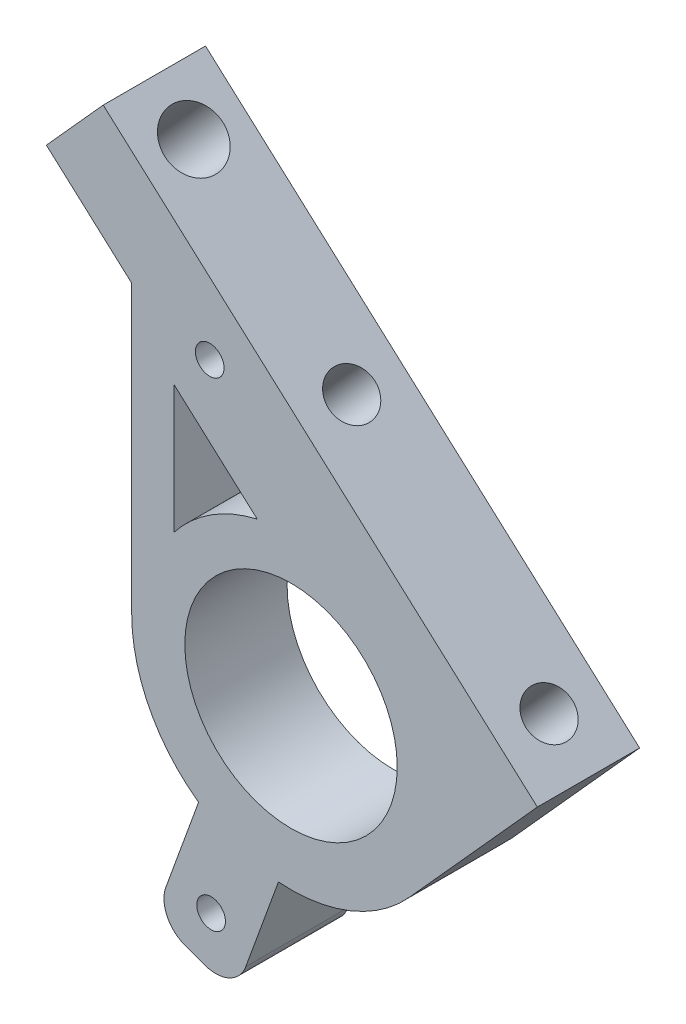
ISO-10303-21;
HEADER;
FILE_DESCRIPTION(('STEP AP214'),'2;1');
FILE_NAME('part.step','',(''),(''),'','','');
FILE_SCHEMA(('AUTOMOTIVE_DESIGN { 1 0 10303 214 1 1 1 1 }'));
ENDSEC;
DATA;
#1=APPLICATION_CONTEXT('core data for automotive mechanical design processes');
#2=APPLICATION_PROTOCOL_DEFINITION('international standard','automotive_design',2000,#1);
#3=PRODUCT_CONTEXT('',#1,'mechanical');
#4=PRODUCT('Part','Part','',(#3));
#5=PRODUCT_RELATED_PRODUCT_CATEGORY('part','',(#4));
#6=PRODUCT_DEFINITION_FORMATION('','',#4);
#7=PRODUCT_DEFINITION_CONTEXT('part definition',#1,'design');
#8=PRODUCT_DEFINITION('design','',#6,#7);
#9=PRODUCT_DEFINITION_SHAPE('','',#8);
#10=(LENGTH_UNIT() NAMED_UNIT(*) SI_UNIT(.MILLI.,.METRE.));
#11=(NAMED_UNIT(*) PLANE_ANGLE_UNIT() SI_UNIT($,.RADIAN.));
#12=(NAMED_UNIT(*) SI_UNIT($,.STERADIAN.) SOLID_ANGLE_UNIT());
#13=UNCERTAINTY_MEASURE_WITH_UNIT(LENGTH_MEASURE(1.E-05),#10,'distance_accuracy_value','');
#14=(GEOMETRIC_REPRESENTATION_CONTEXT(3) GLOBAL_UNCERTAINTY_ASSIGNED_CONTEXT((#13)) GLOBAL_UNIT_ASSIGNED_CONTEXT((#10,
#11,#12)) REPRESENTATION_CONTEXT('',''));
#15=CARTESIAN_POINT('',(0.,0.,0.));
#16=DIRECTION('',(0.,0.,1.));
#17=DIRECTION('',(1.,0.,0.));
#18=AXIS2_PLACEMENT_3D('',#15,#16,#17);
#19=CARTESIAN_POINT('',(0.,0.,9.63));
#20=DIRECTION('',(0.,0.,-1.));
#21=DIRECTION('',(-1.,0.,0.));
#22=AXIS2_PLACEMENT_3D('',#19,#20,#21);
#23=CYLINDRICAL_SURFACE('',#22,15.);
#24=DIRECTION('',(0.,0.,-1.));
#25=VECTOR('',#24,1.);
#26=CARTESIAN_POINT('',(-8.70329833664658,-12.2168980540612,27.8348131289452));
#27=LINE('',#26,#25);
#28=CARTESIAN_POINT('',(-8.70329833664658,-12.2168980540612,9.63));
#29=VERTEX_POINT('',#28);
#30=CARTESIAN_POINT('',(-8.70329833664658,-12.2168980540612,0.));
#31=VERTEX_POINT('',#30);
#32=EDGE_CURVE('E193',#29,#31,#27,.T.);
#33=ORIENTED_EDGE('',*,*,#32,.F.);
#34=CARTESIAN_POINT('',(0.,0.,9.63));
#35=DIRECTION('',(0.,0.,1.));
#36=DIRECTION('',(1.,0.,0.));
#37=AXIS2_PLACEMENT_3D('',#34,#35,#36);
#38=CIRCLE('',#37,15.);
#39=CARTESIAN_POINT('',(-15.,0.,9.63));
#40=VERTEX_POINT('',#39);
#41=EDGE_CURVE('E221',#40,#29,#38,.T.);
#42=ORIENTED_EDGE('',*,*,#41,.F.);
#43=DIRECTION('',(0.,0.,-1.));
#44=VECTOR('',#43,1.);
#45=CARTESIAN_POINT('',(-15.,0.,9.63));
#46=LINE('',#45,#44);
#47=CARTESIAN_POINT('',(-15.,0.,0.));
#48=VERTEX_POINT('',#47);
#49=EDGE_CURVE('E235',#40,#48,#46,.T.);
#50=ORIENTED_EDGE('',*,*,#49,.T.);
#51=CARTESIAN_POINT('',(0.,0.,0.));
#52=DIRECTION('',(0.,0.,1.));
#53=DIRECTION('',(1.,0.,0.));
#54=AXIS2_PLACEMENT_3D('',#51,#52,#53);
#55=CIRCLE('',#54,15.);
#56=EDGE_CURVE('E236',#48,#31,#55,.T.);
#57=ORIENTED_EDGE('',*,*,#56,.T.);
#58=EDGE_LOOP('',(#33,#42,#50,#57));
#59=FACE_BOUND('',#58,.T.);
#60=ADVANCED_FACE('F33',(#59),#23,.T.);
#61=DIRECTION('',(0.,0.,-1.));
#62=VECTOR('',#61,1.);
#63=CARTESIAN_POINT('',(-1.1857573703593,-14.9530592006665,27.8348131289452));
#64=LINE('',#63,#62);
#65=CARTESIAN_POINT('',(-1.1857573703593,-14.9530592006665,9.63));
#66=VERTEX_POINT('',#65);
#67=CARTESIAN_POINT('',(-1.1857573703593,-14.9530592006665,0.));
#68=VERTEX_POINT('',#67);
#69=EDGE_CURVE('E196',#66,#68,#64,.T.);
#70=ORIENTED_EDGE('',*,*,#69,.T.);
#71=CARTESIAN_POINT('',(11.1471723821609,-10.0369590953829,0.));
#72=VERTEX_POINT('',#71);
#73=EDGE_CURVE('E218',#68,#72,#55,.T.);
#74=ORIENTED_EDGE('',*,*,#73,.T.);
#75=DIRECTION('',(0.,0.,-1.));
#76=VECTOR('',#75,1.);
#77=CARTESIAN_POINT('',(11.1471723821609,-10.0369590953829,9.63));
#78=LINE('',#77,#76);
#79=CARTESIAN_POINT('',(11.1471723821609,-10.0369590953829,9.63));
#80=VERTEX_POINT('',#79);
#81=EDGE_CURVE('E263',#80,#72,#78,.T.);
#82=ORIENTED_EDGE('',*,*,#81,.F.);
#83=EDGE_CURVE('E225',#66,#80,#38,.T.);
#84=ORIENTED_EDGE('',*,*,#83,.F.);
#85=EDGE_LOOP('',(#70,#74,#82,#84));
#86=FACE_BOUND('',#85,.T.);
#87=ADVANCED_FACE('F338',(#86),#23,.T.);
#88=CARTESIAN_POINT('',(0.,0.,9.63));
#89=DIRECTION('',(0.,0.,1.));
#90=DIRECTION('',(1.,0.,0.));
#91=AXIS2_PLACEMENT_3D('',#88,#89,#90);
#92=PLANE('',#91);
#93=CARTESIAN_POINT('',(-7.6543469682057,24.3852304515143,9.63));
#94=DIRECTION('',(0.,0.,1.));
#95=DIRECTION('',(1.,0.,0.));
#96=AXIS2_PLACEMENT_3D('',#93,#94,#95);
#97=CIRCLE('',#96,1.35);
#98=CARTESIAN_POINT('',(-6.3043469682057,24.3852304515143,9.63));
#99=VERTEX_POINT('',#98);
#100=EDGE_CURVE('E436',#99,#99,#97,.T.);
#101=ORIENTED_EDGE('',*,*,#100,.F.);
#102=EDGE_LOOP('',(#101));
#103=FACE_BOUND('',#102,.T.);
#104=DIRECTION('',(-0.743144825477393,0.66913060635886,0.));
#105=VECTOR('',#104,1.);
#106=CARTESIAN_POINT('',(-11.,20.6695063241273,9.63));
#107=LINE('',#106,#105);
#108=CARTESIAN_POINT('',(-3.18503915994004,13.632883977708,9.63));
#109=VERTEX_POINT('',#108);
#110=CARTESIAN_POINT('',(-11.,20.6695063241273,9.63));
#111=VERTEX_POINT('',#110);
#112=EDGE_CURVE('E48',#109,#111,#107,.T.);
#113=ORIENTED_EDGE('',*,*,#112,.F.);
#114=CARTESIAN_POINT('',(0.,0.,9.63));
#115=DIRECTION('',(0.,0.,-1.));
#116=DIRECTION('',(-1.,0.,0.));
#117=AXIS2_PLACEMENT_3D('',#114,#115,#116);
#118=CIRCLE('',#117,14.);
#119=CARTESIAN_POINT('',(-11.,8.66025403784439,9.63));
#120=VERTEX_POINT('',#119);
#121=EDGE_CURVE('E154',#120,#109,#118,.T.);
#122=ORIENTED_EDGE('',*,*,#121,.F.);
#123=DIRECTION('',(0.,-1.,0.));
#124=VECTOR('',#123,1.);
#125=CARTESIAN_POINT('',(-11.,20.6695063241273,9.63));
#126=LINE('',#125,#124);
#127=EDGE_CURVE('E157',#111,#120,#126,.T.);
#128=ORIENTED_EDGE('',*,*,#127,.F.);
#129=EDGE_LOOP('',(#113,#122,#128));
#130=FACE_BOUND('',#129,.T.);
#131=CARTESIAN_POINT('',(-7.52444315316466,-20.67323765729,9.63));
#132=DIRECTION('',(0.,0.,1.));
#133=DIRECTION('',(1.,0.,0.));
#134=AXIS2_PLACEMENT_3D('',#131,#132,#133);
#135=CIRCLE('',#134,1.35);
#136=CARTESIAN_POINT('',(-6.17444315316466,-20.67323765729,9.63));
#137=VERTEX_POINT('',#136);
#138=EDGE_CURVE('E187',#137,#137,#135,.T.);
#139=ORIENTED_EDGE('',*,*,#138,.F.);
#140=EDGE_LOOP('',(#139));
#141=FACE_BOUND('',#140,.T.);
#142=DIRECTION('',(0.939692620785909,-0.342020143325666,0.));
#143=VECTOR('',#142,1.);
#144=CARTESIAN_POINT('',(-12.8075400565546,-23.4932095034921,9.63));
#145=LINE('',#144,#143);
#146=CARTESIAN_POINT('',(-9.98846219419685,-24.5192699334691,9.63));
#147=VERTEX_POINT('',#146);
#148=CARTESIAN_POINT('',(-8.10907695262503,-25.2033102201205,9.63));
#149=VERTEX_POINT('',#148);
#150=EDGE_CURVE('E206',#147,#149,#145,.T.);
#151=ORIENTED_EDGE('',*,*,#150,.T.);
#152=CARTESIAN_POINT('',(-7.08301652264803,-22.3842323577627,9.63));
#153=DIRECTION('',(0.,0.,1.));
#154=DIRECTION('',(1.,0.,0.));
#155=AXIS2_PLACEMENT_3D('',#152,#153,#154);
#156=CIRCLE('',#155,3.);
#157=CARTESIAN_POINT('',(-4.2639386602903,-23.4102927877397,9.63));
#158=VERTEX_POINT('',#157);
#159=EDGE_CURVE('E41',#149,#158,#156,.T.);
#160=ORIENTED_EDGE('',*,*,#159,.T.);
#161=DIRECTION('',(0.342020143325667,0.939692620785909,0.));
#162=VECTOR('',#161,1.);
#163=CARTESIAN_POINT('',(-1.1857573703593,-14.9530592006665,9.63));
#164=LINE('',#163,#162);
#165=EDGE_CURVE('E203',#158,#66,#164,.T.);
#166=ORIENTED_EDGE('',*,*,#165,.T.);
#167=ORIENTED_EDGE('',*,*,#83,.T.);
#168=DIRECTION('',(0.66913060635886,0.743144825477393,0.));
#169=VECTOR('',#168,1.);
#170=CARTESIAN_POINT('',(17.8384784457495,-2.60551084060896,9.63));
#171=LINE('',#170,#169);
#172=CARTESIAN_POINT('',(23.1915232966204,3.33964776321019,9.63));
#173=VERTEX_POINT('',#172);
#174=EDGE_CURVE('E224',#80,#173,#171,.T.);
#175=ORIENTED_EDGE('',*,*,#174,.T.);
#176=DIRECTION('',(-0.743144825477393,0.669130606358859,0.));
#177=VECTOR('',#176,1.);
#178=CARTESIAN_POINT('',(-17.6814421046363,40.1418311129475,9.63));
#179=LINE('',#178,#177);
#180=CARTESIAN_POINT('',(-17.6814421046363,40.1418311129475,9.63));
#181=VERTEX_POINT('',#180);
#182=EDGE_CURVE('E227',#173,#181,#179,.T.);
#183=ORIENTED_EDGE('',*,*,#182,.T.);
#184=DIRECTION('',(-0.669130606358859,-0.743144825477393,0.));
#185=VECTOR('',#184,1.);
#186=CARTESIAN_POINT('',(-23.0344869555071,34.1966725091283,9.63));
#187=LINE('',#186,#185);
#188=CARTESIAN_POINT('',(-23.0344869555071,34.1966725091283,9.63));
#189=VERTEX_POINT('',#188);
#190=EDGE_CURVE('E229',#181,#189,#187,.T.);
#191=ORIENTED_EDGE('',*,*,#190,.T.);
#192=DIRECTION('',(0.743144825477394,-0.669130606358859,0.));
#193=VECTOR('',#192,1.);
#194=CARTESIAN_POINT('',(-15.,26.9623879605314,9.63));
#195=LINE('',#194,#193);
#196=CARTESIAN_POINT('',(-15.,26.9623879605314,9.63));
#197=VERTEX_POINT('',#196);
#198=EDGE_CURVE('E231',#189,#197,#195,.T.);
#199=ORIENTED_EDGE('',*,*,#198,.T.);
#200=DIRECTION('',(0.,-1.,0.));
#201=VECTOR('',#200,1.);
#202=CARTESIAN_POINT('',(-15.,0.,9.63));
#203=LINE('',#202,#201);
#204=EDGE_CURVE('E233',#197,#40,#203,.T.);
#205=ORIENTED_EDGE('',*,*,#204,.T.);
#206=ORIENTED_EDGE('',*,*,#41,.T.);
#207=DIRECTION('',(-0.342020143325666,-0.939692620785909,0.));
#208=VECTOR('',#207,1.);
#209=CARTESIAN_POINT('',(-8.70329833664658,-12.2168980540612,9.63));
#210=LINE('',#209,#208);
#211=CARTESIAN_POINT('',(-11.7814796265776,-20.6741316411344,9.63));
#212=VERTEX_POINT('',#211);
#213=EDGE_CURVE('E209',#29,#212,#210,.T.);
#214=ORIENTED_EDGE('',*,*,#213,.T.);
#215=CARTESIAN_POINT('',(-8.96240176421985,-21.7001920711114,9.63));
#216=DIRECTION('',(0.,0.,1.));
#217=DIRECTION('',(1.,0.,0.));
#218=AXIS2_PLACEMENT_3D('',#215,#216,#217);
#219=CIRCLE('',#218,3.);
#220=EDGE_CURVE('E278',#212,#147,#219,.T.);
#221=ORIENTED_EDGE('',*,*,#220,.T.);
#222=EDGE_LOOP('',(#151,#160,#166,#167,#175,#183,#191,#199,#205,#206,#214,#221));
#223=FACE_BOUND('',#222,.T.);
#224=CARTESIAN_POINT('',(0.,0.,9.63));
#225=DIRECTION('',(0.,0.,1.));
#226=DIRECTION('',(1.,0.,0.));
#227=AXIS2_PLACEMENT_3D('',#224,#225,#226);
#228=CIRCLE('',#227,10.);
#229=CARTESIAN_POINT('',(10.,0.,9.63));
#230=VERTEX_POINT('',#229);
#231=EDGE_CURVE('E215',#230,#230,#228,.T.);
#232=ORIENTED_EDGE('',*,*,#231,.F.);
#233=EDGE_LOOP('',(#232));
#234=FACE_BOUND('',#233,.T.);
#235=ADVANCED_FACE('F282',(#103,#130,#141,#223,#234),#92,.T.);
#236=CARTESIAN_POINT('',(0.,0.,0.));
#237=DIRECTION('',(0.,0.,1.));
#238=DIRECTION('',(1.,0.,0.));
#239=AXIS2_PLACEMENT_3D('',#236,#237,#238);
#240=PLANE('',#239);
#241=CARTESIAN_POINT('',(-7.6543469682057,24.3852304515143,0.));
#242=DIRECTION('',(0.,0.,1.));
#243=DIRECTION('',(1.,0.,0.));
#244=AXIS2_PLACEMENT_3D('',#241,#242,#243);
#245=CIRCLE('',#244,1.35);
#246=CARTESIAN_POINT('',(-6.3043469682057,24.3852304515143,0.));
#247=VERTEX_POINT('',#246);
#248=EDGE_CURVE('E160',#247,#247,#245,.F.);
#249=ORIENTED_EDGE('',*,*,#248,.F.);
#250=EDGE_LOOP('',(#249));
#251=FACE_BOUND('',#250,.T.);
#252=CARTESIAN_POINT('',(0.,0.,0.));
#253=DIRECTION('',(0.,0.,-1.));
#254=DIRECTION('',(-1.,0.,0.));
#255=AXIS2_PLACEMENT_3D('',#252,#253,#254);
#256=CIRCLE('',#255,14.);
#257=CARTESIAN_POINT('',(-11.,8.66025403784439,0.));
#258=VERTEX_POINT('',#257);
#259=CARTESIAN_POINT('',(-3.18503915994004,13.632883977708,0.));
#260=VERTEX_POINT('',#259);
#261=EDGE_CURVE('E56',#258,#260,#256,.T.);
#262=ORIENTED_EDGE('',*,*,#261,.T.);
#263=DIRECTION('',(-0.743144825477393,0.66913060635886,0.));
#264=VECTOR('',#263,1.);
#265=CARTESIAN_POINT('',(-11.,20.6695063241273,0.));
#266=LINE('',#265,#264);
#267=CARTESIAN_POINT('',(-11.,20.6695063241273,0.));
#268=VERTEX_POINT('',#267);
#269=EDGE_CURVE('E141',#260,#268,#266,.T.);
#270=ORIENTED_EDGE('',*,*,#269,.T.);
#271=DIRECTION('',(0.,-1.,0.));
#272=VECTOR('',#271,1.);
#273=CARTESIAN_POINT('',(-11.,20.6695063241273,0.));
#274=LINE('',#273,#272);
#275=EDGE_CURVE('E148',#268,#258,#274,.T.);
#276=ORIENTED_EDGE('',*,*,#275,.T.);
#277=EDGE_LOOP('',(#262,#270,#276));
#278=FACE_BOUND('',#277,.T.);
#279=CARTESIAN_POINT('',(-7.52444315316466,-20.67323765729,0.));
#280=DIRECTION('',(0.,0.,1.));
#281=DIRECTION('',(1.,0.,0.));
#282=AXIS2_PLACEMENT_3D('',#279,#280,#281);
#283=CIRCLE('',#282,1.35);
#284=CARTESIAN_POINT('',(-6.17444315316466,-20.67323765729,0.));
#285=VERTEX_POINT('',#284);
#286=EDGE_CURVE('E190',#285,#285,#283,.F.);
#287=ORIENTED_EDGE('',*,*,#286,.F.);
#288=EDGE_LOOP('',(#287));
#289=FACE_BOUND('',#288,.T.);
#290=DIRECTION('',(0.342020143325666,0.939692620785909,0.));
#291=VECTOR('',#290,1.);
#292=CARTESIAN_POINT('',(-1.1857573703593,-14.9530592006665,0.));
#293=LINE('',#292,#291);
#294=CARTESIAN_POINT('',(-4.2639386602903,-23.4102927877397,0.));
#295=VERTEX_POINT('',#294);
#296=EDGE_CURVE('E194',#295,#68,#293,.T.);
#297=ORIENTED_EDGE('',*,*,#296,.F.);
#298=CARTESIAN_POINT('',(-7.08301652264803,-22.3842323577627,0.));
#299=DIRECTION('',(0.,0.,1.));
#300=DIRECTION('',(1.,0.,0.));
#301=AXIS2_PLACEMENT_3D('',#298,#299,#300);
#302=CIRCLE('',#301,3.);
#303=CARTESIAN_POINT('',(-8.10907695262503,-25.2033102201205,0.));
#304=VERTEX_POINT('',#303);
#305=EDGE_CURVE('E271',#295,#304,#302,.F.);
#306=ORIENTED_EDGE('',*,*,#305,.T.);
#307=DIRECTION('',(0.939692620785909,-0.342020143325666,0.));
#308=VECTOR('',#307,1.);
#309=CARTESIAN_POINT('',(-12.8075400565546,-23.4932095034921,0.));
#310=LINE('',#309,#308);
#311=CARTESIAN_POINT('',(-9.98846219419685,-24.5192699334691,0.));
#312=VERTEX_POINT('',#311);
#313=EDGE_CURVE('E197',#312,#304,#310,.T.);
#314=ORIENTED_EDGE('',*,*,#313,.F.);
#315=CARTESIAN_POINT('',(-8.96240176421985,-21.7001920711114,0.));
#316=DIRECTION('',(0.,0.,1.));
#317=DIRECTION('',(1.,0.,0.));
#318=AXIS2_PLACEMENT_3D('',#315,#316,#317);
#319=CIRCLE('',#318,3.);
#320=CARTESIAN_POINT('',(-11.7814796265776,-20.6741316411344,0.));
#321=VERTEX_POINT('',#320);
#322=EDGE_CURVE('E269',#312,#321,#319,.F.);
#323=ORIENTED_EDGE('',*,*,#322,.T.);
#324=DIRECTION('',(-0.342020143325666,-0.939692620785909,0.));
#325=VECTOR('',#324,1.);
#326=CARTESIAN_POINT('',(-8.70329833664658,-12.2168980540612,0.));
#327=LINE('',#326,#325);
#328=EDGE_CURVE('E200',#31,#321,#327,.T.);
#329=ORIENTED_EDGE('',*,*,#328,.F.);
#330=ORIENTED_EDGE('',*,*,#56,.F.);
#331=DIRECTION('',(0.,-1.,0.));
#332=VECTOR('',#331,1.);
#333=CARTESIAN_POINT('',(-15.,0.,0.));
#334=LINE('',#333,#332);
#335=CARTESIAN_POINT('',(-15.,26.9623879605314,0.));
#336=VERTEX_POINT('',#335);
#337=EDGE_CURVE('E247',#336,#48,#334,.T.);
#338=ORIENTED_EDGE('',*,*,#337,.F.);
#339=DIRECTION('',(0.743144825477394,-0.669130606358859,0.));
#340=VECTOR('',#339,1.);
#341=CARTESIAN_POINT('',(-15.,26.9623879605314,0.));
#342=LINE('',#341,#340);
#343=CARTESIAN_POINT('',(-23.0344869555071,34.1966725091283,0.));
#344=VERTEX_POINT('',#343);
#345=EDGE_CURVE('E245',#344,#336,#342,.T.);
#346=ORIENTED_EDGE('',*,*,#345,.F.);
#347=DIRECTION('',(-0.669130606358859,-0.743144825477393,0.));
#348=VECTOR('',#347,1.);
#349=CARTESIAN_POINT('',(-23.0344869555071,34.1966725091283,0.));
#350=LINE('',#349,#348);
#351=CARTESIAN_POINT('',(-17.6814421046363,40.1418311129475,0.));
#352=VERTEX_POINT('',#351);
#353=EDGE_CURVE('E243',#352,#344,#350,.T.);
#354=ORIENTED_EDGE('',*,*,#353,.F.);
#355=DIRECTION('',(-0.743144825477393,0.669130606358859,0.));
#356=VECTOR('',#355,1.);
#357=CARTESIAN_POINT('',(-17.6814421046363,40.1418311129475,0.));
#358=LINE('',#357,#356);
#359=CARTESIAN_POINT('',(23.1915232966204,3.33964776321019,0.));
#360=VERTEX_POINT('',#359);
#361=EDGE_CURVE('E241',#360,#352,#358,.T.);
#362=ORIENTED_EDGE('',*,*,#361,.F.);
#363=DIRECTION('',(0.669130606358858,0.743144825477394,0.));
#364=VECTOR('',#363,1.);
#365=CARTESIAN_POINT('',(23.1915232966204,3.33964776321019,0.));
#366=LINE('',#365,#364);
#367=EDGE_CURVE('E239',#72,#360,#366,.T.);
#368=ORIENTED_EDGE('',*,*,#367,.F.);
#369=ORIENTED_EDGE('',*,*,#73,.F.);
#370=EDGE_LOOP('',(#297,#306,#314,#323,#329,#330,#338,#346,#354,#362,#368,#369));
#371=FACE_BOUND('',#370,.T.);
#372=CARTESIAN_POINT('',(0.,0.,0.));
#373=DIRECTION('',(0.,0.,1.));
#374=DIRECTION('',(1.,0.,0.));
#375=AXIS2_PLACEMENT_3D('',#372,#373,#374);
#376=CIRCLE('',#375,10.);
#377=CARTESIAN_POINT('',(10.,0.,0.));
#378=VERTEX_POINT('',#377);
#379=EDGE_CURVE('E205',#378,#378,#376,.T.);
#380=ORIENTED_EDGE('',*,*,#379,.T.);
#381=EDGE_LOOP('',(#380));
#382=FACE_BOUND('',#381,.T.);
#383=ADVANCED_FACE('F152',(#251,#278,#289,#371,#382),#240,.F.);
#384=CARTESIAN_POINT('',(23.1915232966204,3.33964776321019,9.63));
#385=DIRECTION('',(-0.743144825477394,0.669130606358858,0.));
#386=DIRECTION('',(-0.669130606358858,-0.743144825477394,0.));
#387=AXIS2_PLACEMENT_3D('',#384,#385,#386);
#388=PLANE('',#387);
#389=ORIENTED_EDGE('',*,*,#367,.T.);
#390=DIRECTION('',(0.,0.,-1.));
#391=VECTOR('',#390,1.);
#392=CARTESIAN_POINT('',(23.1915232966204,3.33964776321019,9.63));
#393=LINE('',#392,#391);
#394=EDGE_CURVE('E260',#173,#360,#393,.T.);
#395=ORIENTED_EDGE('',*,*,#394,.F.);
#396=ORIENTED_EDGE('',*,*,#174,.F.);
#397=ORIENTED_EDGE('',*,*,#81,.T.);
#398=EDGE_LOOP('',(#389,#395,#396,#397));
#399=FACE_BOUND('',#398,.T.);
#400=ADVANCED_FACE('F336',(#399),#388,.F.);
#401=CARTESIAN_POINT('',(-17.6814421046363,40.1418311129475,9.63));
#402=DIRECTION('',(-0.669130606358859,-0.743144825477393,0.));
#403=DIRECTION('',(0.743144825477393,-0.669130606358859,0.));
#404=AXIS2_PLACEMENT_3D('',#401,#402,#403);
#405=PLANE('',#404);
#406=CARTESIAN_POINT('',(0.897178532298573,23.413565953976,4.81500000000001));
#407=DIRECTION('',(0.669130606358859,0.743144825477393,0.));
#408=DIRECTION('',(-0.743144825477393,0.669130606358859,0.));
#409=AXIS2_PLACEMENT_3D('',#406,#407,#408);
#410=CIRCLE('',#409,2.2);
#411=CARTESIAN_POINT('',(-0.737740083751693,24.8856532879655,4.81500000000001));
#412=VERTEX_POINT('',#411);
#413=EDGE_CURVE('E174',#412,#412,#410,.T.);
#414=ORIENTED_EDGE('',*,*,#413,.F.);
#415=EDGE_LOOP('',(#414));
#416=FACE_BOUND('',#415,.T.);
#417=CARTESIAN_POINT('',(19.4757991692334,6.68530079500449,4.81500000000001));
#418=DIRECTION('',(0.669130606358859,0.743144825477393,0.));
#419=DIRECTION('',(-0.743144825477393,0.669130606358859,0.));
#420=AXIS2_PLACEMENT_3D('',#417,#418,#419);
#421=CIRCLE('',#420,2.2);
#422=CARTESIAN_POINT('',(17.8408805531831,8.15738812899399,4.81500000000001));
#423=VERTEX_POINT('',#422);
#424=EDGE_CURVE('E168',#423,#423,#421,.T.);
#425=ORIENTED_EDGE('',*,*,#424,.F.);
#426=EDGE_LOOP('',(#425));
#427=FACE_BOUND('',#426,.T.);
#428=CARTESIAN_POINT('',(-13.9657179772493,36.7961780811532,4.81500000000001));
#429=DIRECTION('',(0.669130606358859,0.743144825477393,0.));
#430=DIRECTION('',(-0.743144825477393,0.669130606358859,0.));
#431=AXIS2_PLACEMENT_3D('',#428,#429,#430);
#432=CIRCLE('',#431,2.75);
#433=CARTESIAN_POINT('',(-16.0093662473121,38.63628724864,4.81500000000001));
#434=VERTEX_POINT('',#433);
#435=EDGE_CURVE('E173',#434,#434,#432,.T.);
#436=ORIENTED_EDGE('',*,*,#435,.F.);
#437=EDGE_LOOP('',(#436));
#438=FACE_BOUND('',#437,.T.);
#439=ORIENTED_EDGE('',*,*,#361,.T.);
#440=DIRECTION('',(0.,0.,-1.));
#441=VECTOR('',#440,1.);
#442=CARTESIAN_POINT('',(-17.6814421046363,40.1418311129475,9.63));
#443=LINE('',#442,#441);
#444=EDGE_CURVE('E257',#181,#352,#443,.T.);
#445=ORIENTED_EDGE('',*,*,#444,.F.);
#446=ORIENTED_EDGE('',*,*,#182,.F.);
#447=ORIENTED_EDGE('',*,*,#394,.T.);
#448=EDGE_LOOP('',(#439,#445,#446,#447));
#449=FACE_BOUND('',#448,.T.);
#450=ADVANCED_FACE('F330',(#416,#427,#438,#449),#405,.F.);
#451=CARTESIAN_POINT('',(-23.0344869555071,34.1966725091283,9.63));
#452=DIRECTION('',(0.743144825477393,-0.669130606358859,0.));
#453=DIRECTION('',(0.669130606358859,0.743144825477393,0.));
#454=AXIS2_PLACEMENT_3D('',#451,#452,#453);
#455=PLANE('',#454);
#456=ORIENTED_EDGE('',*,*,#353,.T.);
#457=DIRECTION('',(0.,0.,-1.));
#458=VECTOR('',#457,1.);
#459=CARTESIAN_POINT('',(-23.0344869555071,34.1966725091283,9.63));
#460=LINE('',#459,#458);
#461=EDGE_CURVE('E254',#189,#344,#460,.T.);
#462=ORIENTED_EDGE('',*,*,#461,.F.);
#463=ORIENTED_EDGE('',*,*,#190,.F.);
#464=ORIENTED_EDGE('',*,*,#444,.T.);
#465=EDGE_LOOP('',(#456,#462,#463,#464));
#466=FACE_BOUND('',#465,.T.);
#467=ADVANCED_FACE('F326',(#466),#455,.F.);
#468=CARTESIAN_POINT('',(-15.,26.9623879605314,9.63));
#469=DIRECTION('',(0.669130606358859,0.743144825477394,0.));
#470=DIRECTION('',(-0.743144825477394,0.669130606358859,0.));
#471=AXIS2_PLACEMENT_3D('',#468,#469,#470);
#472=PLANE('',#471);
#473=CARTESIAN_POINT('',(-19.3187628281202,30.851019477334,4.81500000000001));
#474=DIRECTION('',(0.669130606358859,0.743144825477394,0.));
#475=DIRECTION('',(-0.743144825477394,0.669130606358859,0.));
#476=AXIS2_PLACEMENT_3D('',#473,#474,#475);
#477=CIRCLE('',#476,2.75);
#478=CARTESIAN_POINT('',(-21.362411098183,32.6911286448209,4.81500000000001));
#479=VERTEX_POINT('',#478);
#480=EDGE_CURVE('E184',#479,#479,#477,.F.);
#481=ORIENTED_EDGE('',*,*,#480,.F.);
#482=EDGE_LOOP('',(#481));
#483=FACE_BOUND('',#482,.T.);
#484=ORIENTED_EDGE('',*,*,#345,.T.);
#485=DIRECTION('',(0.,0.,-1.));
#486=VECTOR('',#485,1.);
#487=CARTESIAN_POINT('',(-15.,26.9623879605314,9.63));
#488=LINE('',#487,#486);
#489=EDGE_CURVE('E251',#197,#336,#488,.T.);
#490=ORIENTED_EDGE('',*,*,#489,.F.);
#491=ORIENTED_EDGE('',*,*,#198,.F.);
#492=ORIENTED_EDGE('',*,*,#461,.T.);
#493=EDGE_LOOP('',(#484,#490,#491,#492));
#494=FACE_BOUND('',#493,.T.);
#495=ADVANCED_FACE('F322',(#483,#494),#472,.F.);
#496=CARTESIAN_POINT('',(-15.,0.,9.63));
#497=DIRECTION('',(1.,0.,0.));
#498=DIRECTION('',(0.,0.,-1.));
#499=AXIS2_PLACEMENT_3D('',#496,#497,#498);
#500=PLANE('',#499);
#501=ORIENTED_EDGE('',*,*,#337,.T.);
#502=ORIENTED_EDGE('',*,*,#49,.F.);
#503=ORIENTED_EDGE('',*,*,#204,.F.);
#504=ORIENTED_EDGE('',*,*,#489,.T.);
#505=EDGE_LOOP('',(#501,#502,#503,#504));
#506=FACE_BOUND('',#505,.T.);
#507=ADVANCED_FACE('F316',(#506),#500,.F.);
#508=CARTESIAN_POINT('',(0.,0.,9.63));
#509=DIRECTION('',(0.,0.,-1.));
#510=DIRECTION('',(-1.,0.,0.));
#511=AXIS2_PLACEMENT_3D('',#508,#509,#510);
#512=CYLINDRICAL_SURFACE('',#511,10.);
#513=ORIENTED_EDGE('',*,*,#231,.T.);
#514=EDGE_LOOP('',(#513));
#515=FACE_BOUND('',#514,.T.);
#516=ORIENTED_EDGE('',*,*,#379,.F.);
#517=EDGE_LOOP('',(#516));
#518=FACE_BOUND('',#517,.T.);
#519=ADVANCED_FACE('F370',(#515,#518),#512,.F.);
#520=CARTESIAN_POINT('',(-8.70329833664658,-12.2168980540612,27.8348131289452));
#521=DIRECTION('',(0.939692620785909,-0.342020143325666,0.));
#522=DIRECTION('',(0.342020143325666,0.939692620785909,0.));
#523=AXIS2_PLACEMENT_3D('',#520,#521,#522);
#524=PLANE('',#523);
#525=ORIENTED_EDGE('',*,*,#328,.T.);
#526=DIRECTION('',(0.,0.,-1.));
#527=VECTOR('',#526,1.);
#528=CARTESIAN_POINT('',(-11.7814796265776,-20.6741316411344,27.8348131289452));
#529=LINE('',#528,#527);
#530=EDGE_CURVE('E11',#321,#212,#529,.F.);
#531=ORIENTED_EDGE('',*,*,#530,.T.);
#532=ORIENTED_EDGE('',*,*,#213,.F.);
#533=ORIENTED_EDGE('',*,*,#32,.T.);
#534=EDGE_LOOP('',(#525,#531,#532,#533));
#535=FACE_BOUND('',#534,.T.);
#536=ADVANCED_FACE('F307',(#535),#524,.F.);
#537=CARTESIAN_POINT('',(-12.8075400565546,-23.4932095034921,27.8348131289452));
#538=DIRECTION('',(0.342020143325666,0.939692620785909,0.));
#539=DIRECTION('',(-0.939692620785909,0.342020143325666,0.));
#540=AXIS2_PLACEMENT_3D('',#537,#538,#539);
#541=PLANE('',#540);
#542=ORIENTED_EDGE('',*,*,#313,.T.);
#543=DIRECTION('',(0.,0.,-1.));
#544=VECTOR('',#543,1.);
#545=CARTESIAN_POINT('',(-8.10907695262503,-25.2033102201205,27.8348131289452));
#546=LINE('',#545,#544);
#547=EDGE_CURVE('E276',#304,#149,#546,.F.);
#548=ORIENTED_EDGE('',*,*,#547,.T.);
#549=ORIENTED_EDGE('',*,*,#150,.F.);
#550=DIRECTION('',(0.,0.,-1.));
#551=VECTOR('',#550,1.);
#552=CARTESIAN_POINT('',(-9.98846219419685,-24.5192699334691,27.8348131289452));
#553=LINE('',#552,#551);
#554=EDGE_CURVE('E273',#147,#312,#553,.T.);
#555=ORIENTED_EDGE('',*,*,#554,.T.);
#556=EDGE_LOOP('',(#542,#548,#549,#555));
#557=FACE_BOUND('',#556,.T.);
#558=ADVANCED_FACE('F299',(#557),#541,.F.);
#559=CARTESIAN_POINT('',(-1.1857573703593,-14.9530592006665,27.8348131289452));
#560=DIRECTION('',(-0.939692620785909,0.342020143325667,0.));
#561=DIRECTION('',(-0.342020143325667,-0.939692620785909,0.));
#562=AXIS2_PLACEMENT_3D('',#559,#560,#561);
#563=PLANE('',#562);
#564=ORIENTED_EDGE('',*,*,#165,.F.);
#565=DIRECTION('',(0.,0.,-1.));
#566=VECTOR('',#565,1.);
#567=CARTESIAN_POINT('',(-4.2639386602903,-23.4102927877397,27.8348131289452));
#568=LINE('',#567,#566);
#569=EDGE_CURVE('E266',#158,#295,#568,.T.);
#570=ORIENTED_EDGE('',*,*,#569,.T.);
#571=ORIENTED_EDGE('',*,*,#296,.T.);
#572=ORIENTED_EDGE('',*,*,#69,.F.);
#573=EDGE_LOOP('',(#564,#570,#571,#572));
#574=FACE_BOUND('',#573,.T.);
#575=ADVANCED_FACE('F290',(#574),#563,.F.);
#576=CARTESIAN_POINT('',(-7.52444315316466,-20.67323765729,-3.81837661840736));
#577=DIRECTION('',(0.,0.,1.));
#578=DIRECTION('',(1.,0.,0.));
#579=AXIS2_PLACEMENT_3D('',#576,#577,#578);
#580=CYLINDRICAL_SURFACE('',#579,1.35);
#581=ORIENTED_EDGE('',*,*,#286,.T.);
#582=EDGE_LOOP('',(#581));
#583=FACE_BOUND('',#582,.T.);
#584=ORIENTED_EDGE('',*,*,#138,.T.);
#585=EDGE_LOOP('',(#584));
#586=FACE_BOUND('',#585,.T.);
#587=ADVANCED_FACE('F350',(#583,#586),#580,.F.);
#588=CARTESIAN_POINT('',(-7.08301652264803,-22.3842323577627,27.8348131289452));
#589=DIRECTION('',(0.,0.,-1.));
#590=DIRECTION('',(-1.,0.,0.));
#591=AXIS2_PLACEMENT_3D('',#588,#589,#590);
#592=CYLINDRICAL_SURFACE('',#591,3.);
#593=ORIENTED_EDGE('',*,*,#159,.F.);
#594=ORIENTED_EDGE('',*,*,#547,.F.);
#595=ORIENTED_EDGE('',*,*,#305,.F.);
#596=ORIENTED_EDGE('',*,*,#569,.F.);
#597=EDGE_LOOP('',(#593,#594,#595,#596));
#598=FACE_BOUND('',#597,.T.);
#599=ADVANCED_FACE('F293',(#598),#592,.T.);
#600=CARTESIAN_POINT('',(-8.96240176421985,-21.7001920711114,27.8348131289452));
#601=DIRECTION('',(0.,0.,-1.));
#602=DIRECTION('',(-1.,0.,0.));
#603=AXIS2_PLACEMENT_3D('',#600,#601,#602);
#604=CYLINDRICAL_SURFACE('',#603,3.);
#605=ORIENTED_EDGE('',*,*,#220,.F.);
#606=ORIENTED_EDGE('',*,*,#530,.F.);
#607=ORIENTED_EDGE('',*,*,#322,.F.);
#608=ORIENTED_EDGE('',*,*,#554,.F.);
#609=EDGE_LOOP('',(#605,#606,#607,#608));
#610=FACE_BOUND('',#609,.T.);
#611=ADVANCED_FACE('F35',(#610),#604,.T.);
#612=CARTESIAN_POINT('',(-24.5233775099342,25.0707092768477,4.81500000000001));
#613=DIRECTION('',(0.669130606358859,0.743144825477393,0.));
#614=DIRECTION('',(-0.743144825477393,0.669130606358859,0.));
#615=AXIS2_PLACEMENT_3D('',#612,#613,#614);
#616=CYLINDRICAL_SURFACE('',#615,2.75);
#617=ORIENTED_EDGE('',*,*,#480,.T.);
#618=EDGE_LOOP('',(#617));
#619=FACE_BOUND('',#618,.T.);
#620=ORIENTED_EDGE('',*,*,#435,.T.);
#621=EDGE_LOOP('',(#620));
#622=FACE_BOUND('',#621,.T.);
#623=ADVANCED_FACE('F355',(#619,#622),#616,.F.);
#624=CARTESIAN_POINT('',(14.1227543183625,0.740142191185348,4.81500000000001));
#625=DIRECTION('',(0.669130606358859,0.743144825477393,0.));
#626=DIRECTION('',(-0.743144825477393,0.669130606358859,0.));
#627=AXIS2_PLACEMENT_3D('',#624,#625,#626);
#628=CYLINDRICAL_SURFACE('',#627,2.2);
#629=CARTESIAN_POINT('',(14.1227543183625,0.740142191185348,4.81500000000001));
#630=DIRECTION('',(0.669130606358859,0.743144825477393,0.));
#631=DIRECTION('',(-0.743144825477393,0.669130606358859,0.));
#632=AXIS2_PLACEMENT_3D('',#629,#630,#631);
#633=CIRCLE('',#632,2.2);
#634=CARTESIAN_POINT('',(12.4878357023123,2.21222952517484,4.81500000000001));
#635=VERTEX_POINT('',#634);
#636=EDGE_CURVE('E177',#635,#635,#633,.T.);
#637=ORIENTED_EDGE('',*,*,#636,.F.);
#638=EDGE_LOOP('',(#637));
#639=FACE_BOUND('',#638,.T.);
#640=ORIENTED_EDGE('',*,*,#424,.T.);
#641=EDGE_LOOP('',(#640));
#642=FACE_BOUND('',#641,.T.);
#643=ADVANCED_FACE('F395',(#639,#642),#628,.F.);
#644=CARTESIAN_POINT('',(14.1227543183625,0.740142191185348,4.81500000000001));
#645=DIRECTION('',(0.669130606358859,0.743144825477393,0.));
#646=DIRECTION('',(-0.743144825477393,0.669130606358859,0.));
#647=AXIS2_PLACEMENT_3D('',#644,#645,#646);
#648=PLANE('',#647);
#649=ORIENTED_EDGE('',*,*,#636,.T.);
#650=EDGE_LOOP('',(#649));
#651=FACE_BOUND('',#650,.T.);
#652=ADVANCED_FACE('F400',(#651),#648,.T.);
#653=CARTESIAN_POINT('',(-4.4558663185723,17.4684073501568,4.81500000000001));
#654=DIRECTION('',(0.669130606358859,0.743144825477393,0.));
#655=DIRECTION('',(-0.743144825477393,0.669130606358859,0.));
#656=AXIS2_PLACEMENT_3D('',#653,#654,#655);
#657=CYLINDRICAL_SURFACE('',#656,2.2);
#658=CARTESIAN_POINT('',(-4.4558663185723,17.4684073501568,4.81500000000001));
#659=DIRECTION('',(0.669130606358859,0.743144825477393,0.));
#660=DIRECTION('',(-0.743144825477393,0.669130606358859,0.));
#661=AXIS2_PLACEMENT_3D('',#658,#659,#660);
#662=CIRCLE('',#661,2.2);
#663=CARTESIAN_POINT('',(-6.09078493462257,18.9404946841463,4.81500000000001));
#664=VERTEX_POINT('',#663);
#665=EDGE_CURVE('E170',#664,#664,#662,.T.);
#666=ORIENTED_EDGE('',*,*,#665,.F.);
#667=EDGE_LOOP('',(#666));
#668=FACE_BOUND('',#667,.T.);
#669=ORIENTED_EDGE('',*,*,#413,.T.);
#670=EDGE_LOOP('',(#669));
#671=FACE_BOUND('',#670,.T.);
#672=ADVANCED_FACE('F406',(#668,#671),#657,.F.);
#673=CARTESIAN_POINT('',(-4.4558663185723,17.4684073501568,4.81500000000001));
#674=DIRECTION('',(0.669130606358859,0.743144825477393,0.));
#675=DIRECTION('',(-0.743144825477393,0.669130606358859,0.));
#676=AXIS2_PLACEMENT_3D('',#673,#674,#675);
#677=PLANE('',#676);
#678=ORIENTED_EDGE('',*,*,#665,.T.);
#679=EDGE_LOOP('',(#678));
#680=FACE_BOUND('',#679,.T.);
#681=ADVANCED_FACE('F414',(#680),#677,.T.);
#682=CARTESIAN_POINT('',(-11.,20.6695063241273,0.));
#683=DIRECTION('',(0.66913060635886,0.743144825477393,0.));
#684=DIRECTION('',(-0.743144825477393,0.66913060635886,0.));
#685=AXIS2_PLACEMENT_3D('',#682,#683,#684);
#686=PLANE('',#685);
#687=ORIENTED_EDGE('',*,*,#112,.T.);
#688=DIRECTION('',(0.,0.,1.));
#689=VECTOR('',#688,1.);
#690=CARTESIAN_POINT('',(-11.,20.6695063241273,0.));
#691=LINE('',#690,#689);
#692=EDGE_CURVE('E137',#268,#111,#691,.T.);
#693=ORIENTED_EDGE('',*,*,#692,.F.);
#694=ORIENTED_EDGE('',*,*,#269,.F.);
#695=DIRECTION('',(0.,0.,1.));
#696=VECTOR('',#695,1.);
#697=CARTESIAN_POINT('',(-3.18503915994004,13.632883977708,0.));
#698=LINE('',#697,#696);
#699=EDGE_CURVE('E166',#260,#109,#698,.T.);
#700=ORIENTED_EDGE('',*,*,#699,.T.);
#701=EDGE_LOOP('',(#687,#693,#694,#700));
#702=FACE_BOUND('',#701,.T.);
#703=ADVANCED_FACE('F139',(#702),#686,.F.);
#704=CARTESIAN_POINT('',(0.,0.,0.));
#705=DIRECTION('',(0.,0.,1.));
#706=DIRECTION('',(1.,0.,0.));
#707=AXIS2_PLACEMENT_3D('',#704,#705,#706);
#708=CYLINDRICAL_SURFACE('',#707,14.);
#709=ORIENTED_EDGE('',*,*,#121,.T.);
#710=ORIENTED_EDGE('',*,*,#699,.F.);
#711=ORIENTED_EDGE('',*,*,#261,.F.);
#712=DIRECTION('',(0.,0.,1.));
#713=VECTOR('',#712,1.);
#714=CARTESIAN_POINT('',(-11.,8.66025403784439,0.));
#715=LINE('',#714,#713);
#716=EDGE_CURVE('E145',#258,#120,#715,.T.);
#717=ORIENTED_EDGE('',*,*,#716,.T.);
#718=EDGE_LOOP('',(#709,#710,#711,#717));
#719=FACE_BOUND('',#718,.T.);
#720=ADVANCED_FACE('F421',(#719),#708,.T.);
#721=CARTESIAN_POINT('',(-11.,20.6695063241273,0.));
#722=DIRECTION('',(-1.,0.,0.));
#723=DIRECTION('',(0.,0.,1.));
#724=AXIS2_PLACEMENT_3D('',#721,#722,#723);
#725=PLANE('',#724);
#726=ORIENTED_EDGE('',*,*,#127,.T.);
#727=ORIENTED_EDGE('',*,*,#716,.F.);
#728=ORIENTED_EDGE('',*,*,#275,.F.);
#729=ORIENTED_EDGE('',*,*,#692,.T.);
#730=EDGE_LOOP('',(#726,#727,#728,#729));
#731=FACE_BOUND('',#730,.T.);
#732=ADVANCED_FACE('F149',(#731),#725,.F.);
#733=CARTESIAN_POINT('',(-7.6543469682057,24.3852304515143,-3.81837661840736));
#734=DIRECTION('',(0.,0.,1.));
#735=DIRECTION('',(1.,0.,0.));
#736=AXIS2_PLACEMENT_3D('',#733,#734,#735);
#737=CYLINDRICAL_SURFACE('',#736,1.35);
#738=ORIENTED_EDGE('',*,*,#248,.T.);
#739=EDGE_LOOP('',(#738));
#740=FACE_BOUND('',#739,.T.);
#741=ORIENTED_EDGE('',*,*,#100,.T.);
#742=EDGE_LOOP('',(#741));
#743=FACE_BOUND('',#742,.T.);
#744=ADVANCED_FACE('F424',(#740,#743),#737,.F.);
#745=CLOSED_SHELL('',(#60,#87,#235,#383,#400,#450,#467,#495,#507,#519,#536,#558,#575,#587,#599,
#611,#623,#643,#652,#672,#681,#703,#720,#732,#744));
#746=MANIFOLD_SOLID_BREP('B2',#745);
#747=ADVANCED_BREP_SHAPE_REPRESENTATION('',(#18,#746),#14);
#748=SHAPE_DEFINITION_REPRESENTATION(#9,#747);
ENDSEC;
END-ISO-10303-21;
